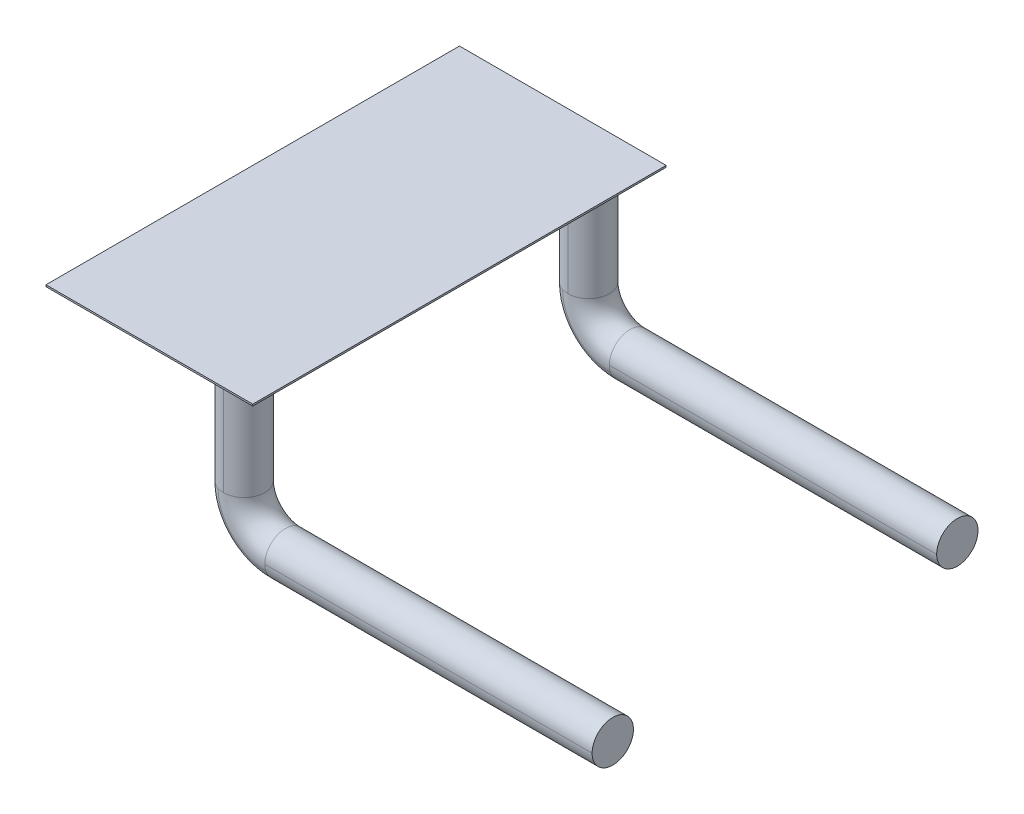
ISO-10303-21;
HEADER;
FILE_DESCRIPTION(('STEP AP214'),'2;1');
FILE_NAME('part.step','',(''),(''),'','','');
FILE_SCHEMA(('AUTOMOTIVE_DESIGN { 1 0 10303 214 1 1 1 1 }'));
ENDSEC;
DATA;
#1=APPLICATION_CONTEXT('core data for automotive mechanical design processes');
#2=APPLICATION_PROTOCOL_DEFINITION('international standard','automotive_design',2000,#1);
#3=PRODUCT_CONTEXT('',#1,'mechanical');
#4=PRODUCT('Part','Part','',(#3));
#5=PRODUCT_RELATED_PRODUCT_CATEGORY('part','',(#4));
#6=PRODUCT_DEFINITION_FORMATION('','',#4);
#7=PRODUCT_DEFINITION_CONTEXT('part definition',#1,'design');
#8=PRODUCT_DEFINITION('design','',#6,#7);
#9=PRODUCT_DEFINITION_SHAPE('','',#8);
#10=(LENGTH_UNIT() NAMED_UNIT(*) SI_UNIT(.MILLI.,.METRE.));
#11=(NAMED_UNIT(*) PLANE_ANGLE_UNIT() SI_UNIT($,.RADIAN.));
#12=(NAMED_UNIT(*) SI_UNIT($,.STERADIAN.) SOLID_ANGLE_UNIT());
#13=UNCERTAINTY_MEASURE_WITH_UNIT(LENGTH_MEASURE(1.E-05),#10,'distance_accuracy_value','');
#14=(GEOMETRIC_REPRESENTATION_CONTEXT(3) GLOBAL_UNCERTAINTY_ASSIGNED_CONTEXT((#13)) GLOBAL_UNIT_ASSIGNED_CONTEXT((#10,
#11,#12)) REPRESENTATION_CONTEXT('',''));
#15=CARTESIAN_POINT('',(0.,0.,0.));
#16=DIRECTION('',(0.,0.,1.));
#17=DIRECTION('',(1.,0.,0.));
#18=AXIS2_PLACEMENT_3D('',#15,#16,#17);
#19=CARTESIAN_POINT('',(1.6256,0.0254,-3.048));
#20=DIRECTION('',(0.,0.,1.));
#21=DIRECTION('',(1.,0.,0.));
#22=AXIS2_PLACEMENT_3D('',#19,#20,#21);
#23=PLANE('',#22);
#24=DIRECTION('',(-1.,0.,0.));
#25=VECTOR('',#24,1.);
#26=CARTESIAN_POINT('',(1.6256,0.,-3.048));
#27=LINE('',#26,#25);
#28=CARTESIAN_POINT('',(1.6256,0.,-3.048));
#29=VERTEX_POINT('',#28);
#30=CARTESIAN_POINT('',(-1.4224,0.,-3.048));
#31=VERTEX_POINT('',#30);
#32=EDGE_CURVE('E11',#29,#31,#27,.T.);
#33=ORIENTED_EDGE('',*,*,#32,.T.);
#34=DIRECTION('',(0.,-1.,0.));
#35=VECTOR('',#34,1.);
#36=CARTESIAN_POINT('',(-1.4224,0.0254,-3.048));
#37=LINE('',#36,#35);
#38=CARTESIAN_POINT('',(-1.4224,0.0254,-3.048));
#39=VERTEX_POINT('',#38);
#40=EDGE_CURVE('E25',#39,#31,#37,.T.);
#41=ORIENTED_EDGE('',*,*,#40,.F.);
#42=DIRECTION('',(-1.,0.,0.));
#43=VECTOR('',#42,1.);
#44=CARTESIAN_POINT('',(1.6256,0.0254,-3.048));
#45=LINE('',#44,#43);
#46=CARTESIAN_POINT('',(1.6256,0.0254,-3.048));
#47=VERTEX_POINT('',#46);
#48=EDGE_CURVE('E408',#47,#39,#45,.T.);
#49=ORIENTED_EDGE('',*,*,#48,.F.);
#50=DIRECTION('',(0.,-1.,0.));
#51=VECTOR('',#50,1.);
#52=CARTESIAN_POINT('',(1.6256,0.0254,-3.048));
#53=LINE('',#52,#51);
#54=EDGE_CURVE('E404',#47,#29,#53,.T.);
#55=ORIENTED_EDGE('',*,*,#54,.T.);
#56=EDGE_LOOP('',(#33,#41,#49,#55));
#57=FACE_BOUND('',#56,.T.);
#58=ADVANCED_FACE('F17',(#57),#23,.F.);
#59=CARTESIAN_POINT('',(1.6256,0.0254,3.048));
#60=DIRECTION('',(-1.,0.,0.));
#61=DIRECTION('',(0.,0.,1.));
#62=AXIS2_PLACEMENT_3D('',#59,#60,#61);
#63=PLANE('',#62);
#64=DIRECTION('',(0.,0.,-1.));
#65=VECTOR('',#64,1.);
#66=CARTESIAN_POINT('',(1.6256,0.,3.048));
#67=LINE('',#66,#65);
#68=CARTESIAN_POINT('',(1.6256,0.,3.048));
#69=VERTEX_POINT('',#68);
#70=EDGE_CURVE('E399',#69,#29,#67,.T.);
#71=ORIENTED_EDGE('',*,*,#70,.T.);
#72=ORIENTED_EDGE('',*,*,#54,.F.);
#73=DIRECTION('',(0.,0.,-1.));
#74=VECTOR('',#73,1.);
#75=CARTESIAN_POINT('',(1.6256,0.0254,3.048));
#76=LINE('',#75,#74);
#77=CARTESIAN_POINT('',(1.6256,0.0254,3.048));
#78=VERTEX_POINT('',#77);
#79=EDGE_CURVE('E394',#78,#47,#76,.T.);
#80=ORIENTED_EDGE('',*,*,#79,.F.);
#81=DIRECTION('',(0.,-1.,0.));
#82=VECTOR('',#81,1.);
#83=CARTESIAN_POINT('',(1.6256,0.0254,3.048));
#84=LINE('',#83,#82);
#85=EDGE_CURVE('E390',#78,#69,#84,.T.);
#86=ORIENTED_EDGE('',*,*,#85,.T.);
#87=EDGE_LOOP('',(#71,#72,#80,#86));
#88=FACE_BOUND('',#87,.T.);
#89=ADVANCED_FACE('F426',(#88),#63,.F.);
#90=CARTESIAN_POINT('',(-1.4224,0.0254,3.048));
#91=DIRECTION('',(0.,0.,-1.));
#92=DIRECTION('',(-1.,0.,0.));
#93=AXIS2_PLACEMENT_3D('',#90,#91,#92);
#94=PLANE('',#93);
#95=DIRECTION('',(1.,0.,0.));
#96=VECTOR('',#95,1.);
#97=CARTESIAN_POINT('',(-1.4224,0.,3.048));
#98=LINE('',#97,#96);
#99=CARTESIAN_POINT('',(-1.4224,0.,3.048));
#100=VERTEX_POINT('',#99);
#101=EDGE_CURVE('E385',#100,#69,#98,.T.);
#102=ORIENTED_EDGE('',*,*,#101,.T.);
#103=ORIENTED_EDGE('',*,*,#85,.F.);
#104=DIRECTION('',(1.,0.,0.));
#105=VECTOR('',#104,1.);
#106=CARTESIAN_POINT('',(-1.4224,0.0254,3.048));
#107=LINE('',#106,#105);
#108=CARTESIAN_POINT('',(-1.4224,0.0254,3.048));
#109=VERTEX_POINT('',#108);
#110=EDGE_CURVE('E380',#109,#78,#107,.T.);
#111=ORIENTED_EDGE('',*,*,#110,.F.);
#112=DIRECTION('',(0.,-1.,0.));
#113=VECTOR('',#112,1.);
#114=CARTESIAN_POINT('',(-1.4224,0.0254,3.048));
#115=LINE('',#114,#113);
#116=EDGE_CURVE('E376',#109,#100,#115,.T.);
#117=ORIENTED_EDGE('',*,*,#116,.T.);
#118=EDGE_LOOP('',(#102,#103,#111,#117));
#119=FACE_BOUND('',#118,.T.);
#120=ADVANCED_FACE('F431',(#119),#94,.F.);
#121=CARTESIAN_POINT('',(-1.4224,0.0254,-3.048));
#122=DIRECTION('',(1.,0.,0.));
#123=DIRECTION('',(0.,0.,-1.));
#124=AXIS2_PLACEMENT_3D('',#121,#122,#123);
#125=PLANE('',#124);
#126=DIRECTION('',(0.,0.,1.));
#127=VECTOR('',#126,1.);
#128=CARTESIAN_POINT('',(-1.4224,0.,-3.048));
#129=LINE('',#128,#127);
#130=EDGE_CURVE('E371',#31,#100,#129,.T.);
#131=ORIENTED_EDGE('',*,*,#130,.T.);
#132=ORIENTED_EDGE('',*,*,#116,.F.);
#133=DIRECTION('',(0.,0.,1.));
#134=VECTOR('',#133,1.);
#135=CARTESIAN_POINT('',(-1.4224,0.0254,-3.048));
#136=LINE('',#135,#134);
#137=EDGE_CURVE('E366',#39,#109,#136,.T.);
#138=ORIENTED_EDGE('',*,*,#137,.F.);
#139=ORIENTED_EDGE('',*,*,#40,.T.);
#140=EDGE_LOOP('',(#131,#132,#138,#139));
#141=FACE_BOUND('',#140,.T.);
#142=ADVANCED_FACE('F418',(#141),#125,.F.);
#143=CARTESIAN_POINT('',(0.,0.0254,0.));
#144=DIRECTION('',(0.,1.,0.));
#145=DIRECTION('',(0.,0.,1.));
#146=AXIS2_PLACEMENT_3D('',#143,#144,#145);
#147=PLANE('',#146);
#148=ORIENTED_EDGE('',*,*,#48,.T.);
#149=ORIENTED_EDGE('',*,*,#137,.T.);
#150=ORIENTED_EDGE('',*,*,#110,.T.);
#151=ORIENTED_EDGE('',*,*,#79,.T.);
#152=EDGE_LOOP('',(#148,#149,#150,#151));
#153=FACE_BOUND('',#152,.T.);
#154=ADVANCED_FACE('F422',(#153),#147,.T.);
#155=CARTESIAN_POINT('',(0.,0.,0.));
#156=DIRECTION('',(0.,1.,0.));
#157=DIRECTION('',(0.,0.,1.));
#158=AXIS2_PLACEMENT_3D('',#155,#156,#157);
#159=PLANE('',#158);
#160=CARTESIAN_POINT('',(0.9906,0.,2.54));
#161=DIRECTION('',(0.,1.,0.));
#162=DIRECTION('',(1.,0.,0.));
#163=AXIS2_PLACEMENT_3D('',#160,#161,#162);
#164=CIRCLE('',#163,0.3048);
#165=CARTESIAN_POINT('',(0.9906,0.,2.2352));
#166=VERTEX_POINT('',#165);
#167=CARTESIAN_POINT('',(0.9906,0.,2.8448));
#168=VERTEX_POINT('',#167);
#169=EDGE_CURVE('E362',#166,#168,#164,.T.);
#170=ORIENTED_EDGE('',*,*,#169,.T.);
#171=CARTESIAN_POINT('',(0.9906,0.,2.54));
#172=DIRECTION('',(0.,1.,0.));
#173=DIRECTION('',(0.,0.,1.));
#174=AXIS2_PLACEMENT_3D('',#171,#172,#173);
#175=CIRCLE('',#174,0.3048);
#176=EDGE_CURVE('E358',#168,#166,#175,.T.);
#177=ORIENTED_EDGE('',*,*,#176,.T.);
#178=EDGE_LOOP('',(#170,#177));
#179=FACE_BOUND('',#178,.T.);
#180=CARTESIAN_POINT('',(0.9906,0.,-2.54));
#181=DIRECTION('',(0.,1.,0.));
#182=DIRECTION('',(1.,0.,0.));
#183=AXIS2_PLACEMENT_3D('',#180,#181,#182);
#184=CIRCLE('',#183,0.3048);
#185=CARTESIAN_POINT('',(0.9906,0.,-2.8448));
#186=VERTEX_POINT('',#185);
#187=CARTESIAN_POINT('',(0.9906,0.,-2.2352));
#188=VERTEX_POINT('',#187);
#189=EDGE_CURVE('E354',#186,#188,#184,.T.);
#190=ORIENTED_EDGE('',*,*,#189,.T.);
#191=CARTESIAN_POINT('',(0.9906,0.,-2.54));
#192=DIRECTION('',(0.,1.,0.));
#193=DIRECTION('',(0.,0.,1.));
#194=AXIS2_PLACEMENT_3D('',#191,#192,#193);
#195=CIRCLE('',#194,0.3048);
#196=EDGE_CURVE('E350',#188,#186,#195,.T.);
#197=ORIENTED_EDGE('',*,*,#196,.T.);
#198=EDGE_LOOP('',(#190,#197));
#199=FACE_BOUND('',#198,.T.);
#200=ORIENTED_EDGE('',*,*,#32,.F.);
#201=ORIENTED_EDGE('',*,*,#70,.F.);
#202=ORIENTED_EDGE('',*,*,#101,.F.);
#203=ORIENTED_EDGE('',*,*,#130,.F.);
#204=EDGE_LOOP('',(#200,#201,#202,#203));
#205=FACE_BOUND('',#204,.T.);
#206=ADVANCED_FACE('F429',(#179,#199,#205),#159,.F.);
#207=CARTESIAN_POINT('',(0.9906,-1.524,-2.54));
#208=DIRECTION('',(0.,1.,0.));
#209=DIRECTION('',(-1.,0.,0.));
#210=AXIS2_PLACEMENT_3D('',#207,#208,#209);
#211=CYLINDRICAL_SURFACE('',#210,0.3048);
#212=DIRECTION('',(0.,1.,0.));
#213=VECTOR('',#212,1.);
#214=CARTESIAN_POINT('',(0.9906,-1.524,-2.8448));
#215=LINE('',#214,#213);
#216=CARTESIAN_POINT('',(0.9906,-1.524,-2.8448));
#217=VERTEX_POINT('',#216);
#218=EDGE_CURVE('E345',#217,#186,#215,.T.);
#219=ORIENTED_EDGE('',*,*,#218,.T.);
#220=ORIENTED_EDGE('',*,*,#196,.F.);
#221=DIRECTION('',(0.,1.,0.));
#222=VECTOR('',#221,1.);
#223=CARTESIAN_POINT('',(0.9906,-1.524,-2.2352));
#224=LINE('',#223,#222);
#225=CARTESIAN_POINT('',(0.9906,-1.524,-2.2352));
#226=VERTEX_POINT('',#225);
#227=EDGE_CURVE('E340',#226,#188,#224,.T.);
#228=ORIENTED_EDGE('',*,*,#227,.F.);
#229=CARTESIAN_POINT('',(0.9906,-1.524,-2.54));
#230=DIRECTION('',(0.,-1.,0.));
#231=DIRECTION('',(0.,0.,-1.));
#232=AXIS2_PLACEMENT_3D('',#229,#230,#231);
#233=CIRCLE('',#232,0.3048);
#234=CARTESIAN_POINT('',(1.08478837988548,-1.524,-2.82988202616676));
#235=VERTEX_POINT('',#234);
#236=EDGE_CURVE('E335',#235,#226,#233,.T.);
#237=ORIENTED_EDGE('',*,*,#236,.F.);
#238=CARTESIAN_POINT('',(0.9906,-1.524,-2.54));
#239=DIRECTION('',(0.,-1.,0.));
#240=DIRECTION('',(0.,0.,-1.));
#241=AXIS2_PLACEMENT_3D('',#238,#239,#240);
#242=CIRCLE('',#241,0.3048);
#243=EDGE_CURVE('E330',#217,#235,#242,.T.);
#244=ORIENTED_EDGE('',*,*,#243,.F.);
#245=EDGE_LOOP('',(#219,#220,#228,#237,#244));
#246=FACE_BOUND('',#245,.T.);
#247=ADVANCED_FACE('F299',(#246),#211,.T.);
#248=CARTESIAN_POINT('',(1.6002,-1.524,-2.54));
#249=DIRECTION('',(0.,0.,1.));
#250=DIRECTION('',(0.707106781186548,0.707106781186547,0.));
#251=AXIS2_PLACEMENT_3D('',#248,#249,#250);
#252=TOROIDAL_SURFACE('',#251,0.6096,0.3048);
#253=CARTESIAN_POINT('',(1.6002,-1.524,-2.82988202616676));
#254=DIRECTION('',(0.,0.,1.));
#255=DIRECTION('',(-1.,0.,0.));
#256=AXIS2_PLACEMENT_3D('',#253,#254,#255);
#257=CIRCLE('',#256,0.515411620114516);
#258=CARTESIAN_POINT('',(1.6002,-2.03941162011452,-2.82988202616676));
#259=VERTEX_POINT('',#258);
#260=EDGE_CURVE('E326',#235,#259,#257,.T.);
#261=ORIENTED_EDGE('',*,*,#260,.T.);
#262=CARTESIAN_POINT('',(1.6002,-2.1336,-2.54));
#263=DIRECTION('',(1.,0.,0.));
#264=DIRECTION('',(0.,0.,-1.));
#265=AXIS2_PLACEMENT_3D('',#262,#263,#264);
#266=CIRCLE('',#265,0.3048);
#267=CARTESIAN_POINT('',(1.6002,-2.1336,-2.8448));
#268=VERTEX_POINT('',#267);
#269=EDGE_CURVE('E321',#268,#259,#266,.T.);
#270=ORIENTED_EDGE('',*,*,#269,.F.);
#271=CARTESIAN_POINT('',(1.6002,-2.1336,-2.54));
#272=DIRECTION('',(1.,0.,0.));
#273=DIRECTION('',(0.,0.,-1.));
#274=AXIS2_PLACEMENT_3D('',#271,#272,#273);
#275=CIRCLE('',#274,0.3048);
#276=CARTESIAN_POINT('',(1.6002,-2.22778837988548,-2.25011797383324));
#277=VERTEX_POINT('',#276);
#278=EDGE_CURVE('E318',#277,#268,#275,.T.);
#279=ORIENTED_EDGE('',*,*,#278,.F.);
#280=CARTESIAN_POINT('',(0.896411620114516,-1.524,-2.25011797383324));
#281=CARTESIAN_POINT('',(0.896411375837469,-1.53551572206614,-2.25011797383324));
#282=CARTESIAN_POINT('',(0.896694249475395,-1.5470314233467,-2.25011797383324));
#283=CARTESIAN_POINT('',(0.897824478605363,-1.57003509469258,-2.25011797383324));
#284=CARTESIAN_POINT('',(0.898671834097407,-1.5815230647579,-2.25011797383324));
#285=CARTESIAN_POINT('',(0.900929272959786,-1.6044435840292,-2.25011797383324));
#286=CARTESIAN_POINT('',(0.902339356330123,-1.6158761332352,-2.25011797383324));
#287=CARTESIAN_POINT('',(0.905718776932097,-1.63865827255834,-2.25011797383324));
#288=CARTESIAN_POINT('',(0.907688114163735,-1.6500078626755,-2.25011797383324));
#289=CARTESIAN_POINT('',(0.912181318815226,-1.67259674065064,-2.25011797383324));
#290=CARTESIAN_POINT('',(0.914705186235078,-1.68383602850864,-2.25011797383324));
#291=CARTESIAN_POINT('',(0.920301365516775,-1.70617722580817,-2.25011797383324));
#292=CARTESIAN_POINT('',(0.923373677378621,-1.71727913524971,-2.25011797383324));
#293=CARTESIAN_POINT('',(0.930059345557295,-1.73931883017129,-2.25011797383324));
#294=CARTESIAN_POINT('',(0.933672701874124,-1.75025661565134,-2.25011797383324));
#295=CARTESIAN_POINT('',(0.941431753673975,-1.7719417125862,-2.25011797383324));
#296=CARTESIAN_POINT('',(0.945577449156996,-1.782689024041,-2.25011797383324));
#297=CARTESIAN_POINT('',(0.954391192052051,-1.80396728170549,-2.25011797383324));
#298=CARTESIAN_POINT('',(0.959059239464083,-1.81449822791517,-2.25011797383324));
#299=CARTESIAN_POINT('',(0.968906440453573,-1.835318385119,-2.25011797383324));
#300=CARTESIAN_POINT('',(0.974085594031031,-1.84560759611314,-2.25011797383324));
#301=CARTESIAN_POINT('',(0.984942530324397,-1.865919495275,-2.25011797383324));
#302=CARTESIAN_POINT('',(0.990620313040307,-1.87594218344272,-2.25011797383324));
#303=CARTESIAN_POINT('',(1.00246082933265,-1.89569689141814,-2.25011797383324));
#304=CARTESIAN_POINT('',(1.00862356290909,-1.90542891122585,-2.25011797383324));
#305=CARTESIAN_POINT('',(1.02141913435807,-1.92457883719309,-2.25011797383324));
#306=CARTESIAN_POINT('',(1.02805197223061,-1.93399674335262,-2.25011797383324));
#307=CARTESIAN_POINT('',(1.04177177318423,-1.95249575346266,-2.25011797383324));
#308=CARTESIAN_POINT('',(1.04885873626532,-1.96157685741317,-2.25011797383324));
#309=CARTESIAN_POINT('',(1.06346971452127,-1.97938038593035,-2.25011797383324));
#310=CARTESIAN_POINT('',(1.07099372969614,-1.98810281049702,-2.25011797383324));
#311=CARTESIAN_POINT('',(1.08646068612807,-2.00516796716173,-2.25011797383324));
#312=CARTESIAN_POINT('',(1.09440362738513,-2.01351069925977,-2.25011797383324));
#313=CARTESIAN_POINT('',(1.11068930074023,-2.02979637261487,-2.25011797383324));
#314=CARTESIAN_POINT('',(1.11903203283827,-2.03773931387193,-2.25011797383324));
#315=CARTESIAN_POINT('',(1.13609718950298,-2.05320627030386,-2.25011797383324));
#316=CARTESIAN_POINT('',(1.14481961406965,-2.06073028547873,-2.25011797383324));
#317=CARTESIAN_POINT('',(1.16262314258683,-2.07534126373468,-2.25011797383324));
#318=CARTESIAN_POINT('',(1.17170424653734,-2.08242822681577,-2.25011797383324));
#319=CARTESIAN_POINT('',(1.19020325664738,-2.09614802776939,-2.25011797383324));
#320=CARTESIAN_POINT('',(1.19962116280691,-2.10278086564193,-2.25011797383324));
#321=CARTESIAN_POINT('',(1.21877108877415,-2.11557643709091,-2.25011797383324));
#322=CARTESIAN_POINT('',(1.22850310858186,-2.12173917066735,-2.25011797383324));
#323=CARTESIAN_POINT('',(1.24825781655728,-2.13357968695969,-2.25011797383324));
#324=CARTESIAN_POINT('',(1.258280504725,-2.1392574696756,-2.25011797383324));
#325=CARTESIAN_POINT('',(1.27859240388686,-2.15011440596897,-2.25011797383324));
#326=CARTESIAN_POINT('',(1.288881614881,-2.15529355954643,-2.25011797383324));
#327=CARTESIAN_POINT('',(1.30970177208483,-2.16514076053592,-2.25011797383324));
#328=CARTESIAN_POINT('',(1.32023271829451,-2.16980880794795,-2.25011797383324));
#329=CARTESIAN_POINT('',(1.341510975959,-2.178622550843,-2.25011797383324));
#330=CARTESIAN_POINT('',(1.35225828741381,-2.18276824632603,-2.25011797383324));
#331=CARTESIAN_POINT('',(1.37394338434866,-2.19052729812588,-2.25011797383324));
#332=CARTESIAN_POINT('',(1.38488116982871,-2.19414065444271,-2.25011797383324));
#333=CARTESIAN_POINT('',(1.4069208647503,-2.20082632262138,-2.25011797383324));
#334=CARTESIAN_POINT('',(1.41802277419183,-2.20389863448323,-2.25011797383324));
#335=CARTESIAN_POINT('',(1.44036397149136,-2.20949481376492,-2.25011797383324));
#336=CARTESIAN_POINT('',(1.45160325934936,-2.21201868118477,-2.25011797383324));
#337=CARTESIAN_POINT('',(1.47419213732451,-2.21651188583626,-2.25011797383324));
#338=CARTESIAN_POINT('',(1.48554172744166,-2.2184812230679,-2.25011797383324));
#339=CARTESIAN_POINT('',(1.50832386676481,-2.22186064366988,-2.25011797383324));
#340=CARTESIAN_POINT('',(1.5197564159708,-2.22327072704021,-2.25011797383324));
#341=CARTESIAN_POINT('',(1.5426769352421,-2.22552816590259,-2.25011797383324));
#342=CARTESIAN_POINT('',(1.55416490530742,-2.22637552139464,-2.25011797383324));
#343=CARTESIAN_POINT('',(1.5771685766533,-2.22750575052461,-2.25011797383324));
#344=CARTESIAN_POINT('',(1.58868427793386,-2.22778862416253,-2.25011797383324));
#345=CARTESIAN_POINT('',(1.6002,-2.22778837988548,-2.25011797383324));
#346=B_SPLINE_CURVE_WITH_KNOTS('',3,(#280,#281,#282,#283,#284,#285,#286,#287,#288,#289,#290,
#291,#292,#293,#294,#295,#296,#297,#298,#299,#300,#301,#302,#303,#304,#305,#306,#307,#308,#309,
#310,#311,#312,#313,#314,#315,#316,#317,#318,#319,#320,#321,#322,#323,#324,#325,#326,#327,#328,
#329,#330,#331,#332,#333,#334,#335,#336,#337,#338,#339,#340,#341,#342,#343,#344,#345),
.UNSPECIFIED.,.F.,.F.,(4,2,2,2,2,2,2,2,2,2,2,2,2,2,2,2,2,2,2,2,2,2,2,2,2,2,2,2,2,2,2,2,4),(0.,
0.0345436629250793,0.0690873258501591,0.103630988775239,0.138174651700319,0.172718314625398,
0.207261977550478,0.241805640475558,0.276349303400638,0.310892966325717,0.345436629250797,
0.379980292175877,0.414523955100956,0.449067618026036,0.483611280951116,0.518154943876196,
0.552698606801275,0.587242269726355,0.621785932651434,0.656329595576514,0.690873258501594,
0.725416921426673,0.759960584351753,0.794504247276833,0.829047910201912,0.863591573126992,
0.898135236052072,0.932678898977152,0.967222561902231,1.00176622482731,1.03630988775239,
1.07085355067747,1.10539721360255),.UNSPECIFIED.);
#347=CARTESIAN_POINT('',(0.896411620114516,-1.524,-2.25011797383324));
#348=VERTEX_POINT('',#347);
#349=EDGE_CURVE('E316',#348,#277,#346,.T.);
#350=ORIENTED_EDGE('',*,*,#349,.F.);
#351=CARTESIAN_POINT('',(0.9906,-1.524,-2.54));
#352=DIRECTION('',(0.,-1.,0.));
#353=DIRECTION('',(0.,0.,-1.));
#354=AXIS2_PLACEMENT_3D('',#351,#352,#353);
#355=CIRCLE('',#354,0.3048);
#356=EDGE_CURVE('E640',#348,#217,#355,.T.);
#357=ORIENTED_EDGE('',*,*,#356,.T.);
#358=ORIENTED_EDGE('',*,*,#243,.T.);
#359=EDGE_LOOP('',(#261,#270,#279,#350,#357,#358));
#360=FACE_BOUND('',#359,.T.);
#361=ADVANCED_FACE('F294',(#360),#252,.T.);
#362=CARTESIAN_POINT('',(0.9906,-1.524,-2.54));
#363=DIRECTION('',(0.,1.,0.));
#364=DIRECTION('',(1.,0.,0.));
#365=AXIS2_PLACEMENT_3D('',#362,#363,#364);
#366=CYLINDRICAL_SURFACE('',#365,0.3048);
#367=ORIENTED_EDGE('',*,*,#218,.F.);
#368=ORIENTED_EDGE('',*,*,#356,.F.);
#369=CARTESIAN_POINT('',(0.9906,-1.524,-2.54));
#370=DIRECTION('',(0.,-1.,0.));
#371=DIRECTION('',(0.,0.,-1.));
#372=AXIS2_PLACEMENT_3D('',#369,#370,#371);
#373=CIRCLE('',#372,0.3048);
#374=EDGE_CURVE('E269',#226,#348,#373,.T.);
#375=ORIENTED_EDGE('',*,*,#374,.F.);
#376=ORIENTED_EDGE('',*,*,#227,.T.);
#377=ORIENTED_EDGE('',*,*,#189,.F.);
#378=EDGE_LOOP('',(#367,#368,#375,#376,#377));
#379=FACE_BOUND('',#378,.T.);
#380=ADVANCED_FACE('F289',(#379),#366,.T.);
#381=CARTESIAN_POINT('',(1.6002,-1.524,-2.54));
#382=DIRECTION('',(0.,0.,1.));
#383=DIRECTION('',(0.707106781186548,0.707106781186547,0.));
#384=AXIS2_PLACEMENT_3D('',#381,#382,#383);
#385=TOROIDAL_SURFACE('',#384,0.6096,0.3048);
#386=ORIENTED_EDGE('',*,*,#260,.F.);
#387=ORIENTED_EDGE('',*,*,#236,.T.);
#388=ORIENTED_EDGE('',*,*,#374,.T.);
#389=ORIENTED_EDGE('',*,*,#349,.T.);
#390=CARTESIAN_POINT('',(1.6002,-2.1336,-2.54));
#391=DIRECTION('',(1.,0.,0.));
#392=DIRECTION('',(0.,0.,-1.));
#393=AXIS2_PLACEMENT_3D('',#390,#391,#392);
#394=CIRCLE('',#393,0.3048);
#395=CARTESIAN_POINT('',(1.6002,-2.1336,-2.2352));
#396=VERTEX_POINT('',#395);
#397=EDGE_CURVE('E264',#396,#277,#394,.T.);
#398=ORIENTED_EDGE('',*,*,#397,.F.);
#399=CARTESIAN_POINT('',(1.6002,-2.1336,-2.54));
#400=DIRECTION('',(1.,0.,0.));
#401=DIRECTION('',(0.,0.,-1.));
#402=AXIS2_PLACEMENT_3D('',#399,#400,#401);
#403=CIRCLE('',#402,0.3048);
#404=EDGE_CURVE('E259',#259,#396,#403,.T.);
#405=ORIENTED_EDGE('',*,*,#404,.F.);
#406=EDGE_LOOP('',(#386,#387,#388,#389,#398,#405));
#407=FACE_BOUND('',#406,.T.);
#408=ADVANCED_FACE('F278',(#407),#385,.T.);
#409=CARTESIAN_POINT('',(1.6002,-2.1336,-2.54));
#410=DIRECTION('',(1.,0.,0.));
#411=DIRECTION('',(0.,-1.,0.));
#412=AXIS2_PLACEMENT_3D('',#409,#410,#411);
#413=CYLINDRICAL_SURFACE('',#412,0.3048);
#414=DIRECTION('',(1.,0.,0.));
#415=VECTOR('',#414,1.);
#416=CARTESIAN_POINT('',(1.6002,-2.1336,-2.2352));
#417=LINE('',#416,#415);
#418=CARTESIAN_POINT('',(6.4262,-2.1336,-2.2352));
#419=VERTEX_POINT('',#418);
#420=EDGE_CURVE('E255',#396,#419,#417,.T.);
#421=ORIENTED_EDGE('',*,*,#420,.T.);
#422=CARTESIAN_POINT('',(6.4262,-2.1336,-2.54));
#423=DIRECTION('',(1.,0.,0.));
#424=DIRECTION('',(0.,0.,-1.));
#425=AXIS2_PLACEMENT_3D('',#422,#423,#424);
#426=CIRCLE('',#425,0.3048);
#427=CARTESIAN_POINT('',(6.4262,-2.1336,-2.8448));
#428=VERTEX_POINT('',#427);
#429=EDGE_CURVE('E250',#428,#419,#426,.T.);
#430=ORIENTED_EDGE('',*,*,#429,.F.);
#431=DIRECTION('',(1.,0.,0.));
#432=VECTOR('',#431,1.);
#433=CARTESIAN_POINT('',(1.6002,-2.1336,-2.8448));
#434=LINE('',#433,#432);
#435=EDGE_CURVE('E245',#268,#428,#434,.T.);
#436=ORIENTED_EDGE('',*,*,#435,.F.);
#437=ORIENTED_EDGE('',*,*,#269,.T.);
#438=ORIENTED_EDGE('',*,*,#404,.T.);
#439=EDGE_LOOP('',(#421,#430,#436,#437,#438));
#440=FACE_BOUND('',#439,.T.);
#441=ADVANCED_FACE('F288',(#440),#413,.T.);
#442=CARTESIAN_POINT('',(1.6002,-2.1336,-2.54));
#443=DIRECTION('',(1.,0.,0.));
#444=DIRECTION('',(0.,1.,0.));
#445=AXIS2_PLACEMENT_3D('',#442,#443,#444);
#446=CYLINDRICAL_SURFACE('',#445,0.3048);
#447=ORIENTED_EDGE('',*,*,#420,.F.);
#448=ORIENTED_EDGE('',*,*,#397,.T.);
#449=ORIENTED_EDGE('',*,*,#278,.T.);
#450=ORIENTED_EDGE('',*,*,#435,.T.);
#451=CARTESIAN_POINT('',(6.4262,-2.1336,-2.54));
#452=DIRECTION('',(1.,0.,0.));
#453=DIRECTION('',(0.,0.,-1.));
#454=AXIS2_PLACEMENT_3D('',#451,#452,#453);
#455=CIRCLE('',#454,0.3048);
#456=EDGE_CURVE('E240',#419,#428,#455,.T.);
#457=ORIENTED_EDGE('',*,*,#456,.F.);
#458=EDGE_LOOP('',(#447,#448,#449,#450,#457));
#459=FACE_BOUND('',#458,.T.);
#460=ADVANCED_FACE('F522',(#459),#446,.T.);
#461=CARTESIAN_POINT('',(6.4262,-2.1336,-2.54));
#462=DIRECTION('',(1.,0.,0.));
#463=DIRECTION('',(0.,0.,-1.));
#464=AXIS2_PLACEMENT_3D('',#461,#462,#463);
#465=PLANE('',#464);
#466=ORIENTED_EDGE('',*,*,#429,.T.);
#467=ORIENTED_EDGE('',*,*,#456,.T.);
#468=EDGE_LOOP('',(#466,#467));
#469=FACE_BOUND('',#468,.T.);
#470=ADVANCED_FACE('F532',(#469),#465,.T.);
#471=CARTESIAN_POINT('',(0.9906,-1.524,2.54));
#472=DIRECTION('',(0.,1.,0.));
#473=DIRECTION('',(-1.,0.,0.));
#474=AXIS2_PLACEMENT_3D('',#471,#472,#473);
#475=CYLINDRICAL_SURFACE('',#474,0.3048);
#476=DIRECTION('',(0.,1.,0.));
#477=VECTOR('',#476,1.);
#478=CARTESIAN_POINT('',(0.9906,-1.524,2.2352));
#479=LINE('',#478,#477);
#480=CARTESIAN_POINT('',(0.9906,-1.524,2.2352));
#481=VERTEX_POINT('',#480);
#482=EDGE_CURVE('E235',#481,#166,#479,.T.);
#483=ORIENTED_EDGE('',*,*,#482,.T.);
#484=ORIENTED_EDGE('',*,*,#176,.F.);
#485=DIRECTION('',(0.,1.,0.));
#486=VECTOR('',#485,1.);
#487=CARTESIAN_POINT('',(0.9906,-1.524,2.8448));
#488=LINE('',#487,#486);
#489=CARTESIAN_POINT('',(0.9906,-1.524,2.8448));
#490=VERTEX_POINT('',#489);
#491=EDGE_CURVE('E230',#490,#168,#488,.T.);
#492=ORIENTED_EDGE('',*,*,#491,.F.);
#493=CARTESIAN_POINT('',(0.9906,-1.524,2.54));
#494=DIRECTION('',(0.,-1.,0.));
#495=DIRECTION('',(0.,0.,-1.));
#496=AXIS2_PLACEMENT_3D('',#493,#494,#495);
#497=CIRCLE('',#496,0.3048);
#498=CARTESIAN_POINT('',(1.08478837988548,-1.524,2.25011797383324));
#499=VERTEX_POINT('',#498);
#500=EDGE_CURVE('E225',#499,#490,#497,.T.);
#501=ORIENTED_EDGE('',*,*,#500,.F.);
#502=CARTESIAN_POINT('',(0.9906,-1.524,2.54));
#503=DIRECTION('',(0.,-1.,0.));
#504=DIRECTION('',(0.,0.,-1.));
#505=AXIS2_PLACEMENT_3D('',#502,#503,#504);
#506=CIRCLE('',#505,0.3048);
#507=EDGE_CURVE('E220',#481,#499,#506,.T.);
#508=ORIENTED_EDGE('',*,*,#507,.F.);
#509=EDGE_LOOP('',(#483,#484,#492,#501,#508));
#510=FACE_BOUND('',#509,.T.);
#511=ADVANCED_FACE('F192',(#510),#475,.T.);
#512=CARTESIAN_POINT('',(1.6002,-1.524,2.54));
#513=DIRECTION('',(0.,0.,1.));
#514=DIRECTION('',(0.707106781186548,0.707106781186547,0.));
#515=AXIS2_PLACEMENT_3D('',#512,#513,#514);
#516=TOROIDAL_SURFACE('',#515,0.6096,0.3048);
#517=CARTESIAN_POINT('',(1.6002,-1.524,2.25011797383324));
#518=DIRECTION('',(0.,0.,1.));
#519=DIRECTION('',(-1.,0.,0.));
#520=AXIS2_PLACEMENT_3D('',#517,#518,#519);
#521=CIRCLE('',#520,0.515411620114516);
#522=CARTESIAN_POINT('',(1.6002,-2.03941162011452,2.25011797383324));
#523=VERTEX_POINT('',#522);
#524=EDGE_CURVE('E216',#499,#523,#521,.T.);
#525=ORIENTED_EDGE('',*,*,#524,.T.);
#526=CARTESIAN_POINT('',(1.6002,-2.1336,2.54));
#527=DIRECTION('',(1.,0.,0.));
#528=DIRECTION('',(0.,0.,-1.));
#529=AXIS2_PLACEMENT_3D('',#526,#527,#528);
#530=CIRCLE('',#529,0.3048);
#531=CARTESIAN_POINT('',(1.6002,-2.1336,2.2352));
#532=VERTEX_POINT('',#531);
#533=EDGE_CURVE('E212',#532,#523,#530,.T.);
#534=ORIENTED_EDGE('',*,*,#533,.F.);
#535=CARTESIAN_POINT('',(1.6002,-2.1336,2.54));
#536=DIRECTION('',(1.,0.,0.));
#537=DIRECTION('',(0.,0.,-1.));
#538=AXIS2_PLACEMENT_3D('',#535,#536,#537);
#539=CIRCLE('',#538,0.3048);
#540=CARTESIAN_POINT('',(1.6002,-2.22778837988548,2.82988202616676));
#541=VERTEX_POINT('',#540);
#542=EDGE_CURVE('E143',#541,#532,#539,.T.);
#543=ORIENTED_EDGE('',*,*,#542,.F.);
#544=CARTESIAN_POINT('',(0.896411620114516,-1.524,2.82988202616676));
#545=CARTESIAN_POINT('',(0.896411375837469,-1.53551572206614,2.82988202616676));
#546=CARTESIAN_POINT('',(0.896694249475395,-1.5470314233467,2.82988202616676));
#547=CARTESIAN_POINT('',(0.897824478605363,-1.57003509469258,2.82988202616676));
#548=CARTESIAN_POINT('',(0.898671834097407,-1.5815230647579,2.82988202616676));
#549=CARTESIAN_POINT('',(0.900929272959786,-1.6044435840292,2.82988202616676));
#550=CARTESIAN_POINT('',(0.902339356330123,-1.6158761332352,2.82988202616676));
#551=CARTESIAN_POINT('',(0.905718776932097,-1.63865827255834,2.82988202616676));
#552=CARTESIAN_POINT('',(0.907688114163735,-1.6500078626755,2.82988202616676));
#553=CARTESIAN_POINT('',(0.912181318815226,-1.67259674065064,2.82988202616676));
#554=CARTESIAN_POINT('',(0.914705186235078,-1.68383602850864,2.82988202616676));
#555=CARTESIAN_POINT('',(0.920301365516775,-1.70617722580817,2.82988202616676));
#556=CARTESIAN_POINT('',(0.923373677378621,-1.71727913524971,2.82988202616676));
#557=CARTESIAN_POINT('',(0.930059345557295,-1.73931883017129,2.82988202616676));
#558=CARTESIAN_POINT('',(0.933672701874124,-1.75025661565134,2.82988202616676));
#559=CARTESIAN_POINT('',(0.941431753673975,-1.7719417125862,2.82988202616676));
#560=CARTESIAN_POINT('',(0.945577449156996,-1.782689024041,2.82988202616676));
#561=CARTESIAN_POINT('',(0.954391192052051,-1.80396728170549,2.82988202616676));
#562=CARTESIAN_POINT('',(0.959059239464083,-1.81449822791517,2.82988202616676));
#563=CARTESIAN_POINT('',(0.968906440453573,-1.835318385119,2.82988202616676));
#564=CARTESIAN_POINT('',(0.974085594031031,-1.84560759611314,2.82988202616676));
#565=CARTESIAN_POINT('',(0.984942530324397,-1.865919495275,2.82988202616676));
#566=CARTESIAN_POINT('',(0.990620313040307,-1.87594218344272,2.82988202616676));
#567=CARTESIAN_POINT('',(1.00246082933265,-1.89569689141814,2.82988202616676));
#568=CARTESIAN_POINT('',(1.00862356290909,-1.90542891122585,2.82988202616676));
#569=CARTESIAN_POINT('',(1.02141913435807,-1.92457883719309,2.82988202616676));
#570=CARTESIAN_POINT('',(1.02805197223061,-1.93399674335262,2.82988202616676));
#571=CARTESIAN_POINT('',(1.04177177318423,-1.95249575346266,2.82988202616676));
#572=CARTESIAN_POINT('',(1.04885873626532,-1.96157685741317,2.82988202616676));
#573=CARTESIAN_POINT('',(1.06346971452127,-1.97938038593035,2.82988202616676));
#574=CARTESIAN_POINT('',(1.07099372969614,-1.98810281049702,2.82988202616676));
#575=CARTESIAN_POINT('',(1.08646068612807,-2.00516796716173,2.82988202616676));
#576=CARTESIAN_POINT('',(1.09440362738513,-2.01351069925977,2.82988202616676));
#577=CARTESIAN_POINT('',(1.11068930074023,-2.02979637261487,2.82988202616676));
#578=CARTESIAN_POINT('',(1.11903203283827,-2.03773931387193,2.82988202616676));
#579=CARTESIAN_POINT('',(1.13609718950298,-2.05320627030386,2.82988202616676));
#580=CARTESIAN_POINT('',(1.14481961406965,-2.06073028547873,2.82988202616676));
#581=CARTESIAN_POINT('',(1.16262314258683,-2.07534126373468,2.82988202616676));
#582=CARTESIAN_POINT('',(1.17170424653734,-2.08242822681577,2.82988202616676));
#583=CARTESIAN_POINT('',(1.19020325664738,-2.09614802776939,2.82988202616676));
#584=CARTESIAN_POINT('',(1.19962116280691,-2.10278086564193,2.82988202616676));
#585=CARTESIAN_POINT('',(1.21877108877415,-2.11557643709091,2.82988202616676));
#586=CARTESIAN_POINT('',(1.22850310858186,-2.12173917066735,2.82988202616676));
#587=CARTESIAN_POINT('',(1.24825781655728,-2.13357968695969,2.82988202616676));
#588=CARTESIAN_POINT('',(1.258280504725,-2.1392574696756,2.82988202616676));
#589=CARTESIAN_POINT('',(1.27859240388686,-2.15011440596897,2.82988202616676));
#590=CARTESIAN_POINT('',(1.288881614881,-2.15529355954643,2.82988202616676));
#591=CARTESIAN_POINT('',(1.30970177208483,-2.16514076053592,2.82988202616676));
#592=CARTESIAN_POINT('',(1.32023271829451,-2.16980880794795,2.82988202616676));
#593=CARTESIAN_POINT('',(1.341510975959,-2.178622550843,2.82988202616676));
#594=CARTESIAN_POINT('',(1.35225828741381,-2.18276824632603,2.82988202616676));
#595=CARTESIAN_POINT('',(1.37394338434866,-2.19052729812588,2.82988202616676));
#596=CARTESIAN_POINT('',(1.38488116982871,-2.19414065444271,2.82988202616676));
#597=CARTESIAN_POINT('',(1.4069208647503,-2.20082632262138,2.82988202616676));
#598=CARTESIAN_POINT('',(1.41802277419183,-2.20389863448323,2.82988202616676));
#599=CARTESIAN_POINT('',(1.44036397149136,-2.20949481376492,2.82988202616676));
#600=CARTESIAN_POINT('',(1.45160325934936,-2.21201868118477,2.82988202616676));
#601=CARTESIAN_POINT('',(1.47419213732451,-2.21651188583626,2.82988202616676));
#602=CARTESIAN_POINT('',(1.48554172744166,-2.2184812230679,2.82988202616676));
#603=CARTESIAN_POINT('',(1.50832386676481,-2.22186064366988,2.82988202616676));
#604=CARTESIAN_POINT('',(1.5197564159708,-2.22327072704021,2.82988202616676));
#605=CARTESIAN_POINT('',(1.5426769352421,-2.22552816590259,2.82988202616676));
#606=CARTESIAN_POINT('',(1.55416490530742,-2.22637552139464,2.82988202616676));
#607=CARTESIAN_POINT('',(1.5771685766533,-2.22750575052461,2.82988202616676));
#608=CARTESIAN_POINT('',(1.58868427793386,-2.22778862416253,2.82988202616676));
#609=CARTESIAN_POINT('',(1.6002,-2.22778837988548,2.82988202616676));
#610=B_SPLINE_CURVE_WITH_KNOTS('',3,(#544,#545,#546,#547,#548,#549,#550,#551,#552,#553,#554,
#555,#556,#557,#558,#559,#560,#561,#562,#563,#564,#565,#566,#567,#568,#569,#570,#571,#572,#573,
#574,#575,#576,#577,#578,#579,#580,#581,#582,#583,#584,#585,#586,#587,#588,#589,#590,#591,#592,
#593,#594,#595,#596,#597,#598,#599,#600,#601,#602,#603,#604,#605,#606,#607,#608,#609),
.UNSPECIFIED.,.F.,.F.,(4,2,2,2,2,2,2,2,2,2,2,2,2,2,2,2,2,2,2,2,2,2,2,2,2,2,2,2,2,2,2,2,4),(0.,
0.0345436629250793,0.0690873258501591,0.103630988775239,0.138174651700319,0.172718314625398,
0.207261977550478,0.241805640475558,0.276349303400638,0.310892966325717,0.345436629250797,
0.379980292175877,0.414523955100956,0.449067618026036,0.483611280951116,0.518154943876196,
0.552698606801275,0.587242269726355,0.621785932651434,0.656329595576514,0.690873258501594,
0.725416921426673,0.759960584351753,0.794504247276833,0.829047910201912,0.863591573126992,
0.898135236052072,0.932678898977152,0.967222561902231,1.00176622482731,1.03630988775239,
1.07085355067747,1.10539721360255),.UNSPECIFIED.);
#611=CARTESIAN_POINT('',(0.896411620114516,-1.524,2.82988202616676));
#612=VERTEX_POINT('',#611);
#613=EDGE_CURVE('E209',#612,#541,#610,.T.);
#614=ORIENTED_EDGE('',*,*,#613,.F.);
#615=CARTESIAN_POINT('',(0.9906,-1.524,2.54));
#616=DIRECTION('',(0.,-1.,0.));
#617=DIRECTION('',(0.,0.,-1.));
#618=AXIS2_PLACEMENT_3D('',#615,#616,#617);
#619=CIRCLE('',#618,0.3048);
#620=EDGE_CURVE('E633',#612,#481,#619,.T.);
#621=ORIENTED_EDGE('',*,*,#620,.T.);
#622=ORIENTED_EDGE('',*,*,#507,.T.);
#623=EDGE_LOOP('',(#525,#534,#543,#614,#621,#622));
#624=FACE_BOUND('',#623,.T.);
#625=ADVANCED_FACE('F187',(#624),#516,.T.);
#626=CARTESIAN_POINT('',(0.9906,-1.524,2.54));
#627=DIRECTION('',(0.,1.,0.));
#628=DIRECTION('',(1.,0.,0.));
#629=AXIS2_PLACEMENT_3D('',#626,#627,#628);
#630=CYLINDRICAL_SURFACE('',#629,0.3048);
#631=ORIENTED_EDGE('',*,*,#482,.F.);
#632=ORIENTED_EDGE('',*,*,#620,.F.);
#633=CARTESIAN_POINT('',(0.9906,-1.524,2.54));
#634=DIRECTION('',(0.,-1.,0.));
#635=DIRECTION('',(0.,0.,-1.));
#636=AXIS2_PLACEMENT_3D('',#633,#634,#635);
#637=CIRCLE('',#636,0.3048);
#638=EDGE_CURVE('E163',#490,#612,#637,.T.);
#639=ORIENTED_EDGE('',*,*,#638,.F.);
#640=ORIENTED_EDGE('',*,*,#491,.T.);
#641=ORIENTED_EDGE('',*,*,#169,.F.);
#642=EDGE_LOOP('',(#631,#632,#639,#640,#641));
#643=FACE_BOUND('',#642,.T.);
#644=ADVANCED_FACE('F182',(#643),#630,.T.);
#645=CARTESIAN_POINT('',(1.6002,-1.524,2.54));
#646=DIRECTION('',(0.,0.,1.));
#647=DIRECTION('',(0.707106781186548,0.707106781186547,0.));
#648=AXIS2_PLACEMENT_3D('',#645,#646,#647);
#649=TOROIDAL_SURFACE('',#648,0.6096,0.3048);
#650=ORIENTED_EDGE('',*,*,#524,.F.);
#651=ORIENTED_EDGE('',*,*,#500,.T.);
#652=ORIENTED_EDGE('',*,*,#638,.T.);
#653=ORIENTED_EDGE('',*,*,#613,.T.);
#654=CARTESIAN_POINT('',(1.6002,-2.1336,2.54));
#655=DIRECTION('',(1.,0.,0.));
#656=DIRECTION('',(0.,0.,-1.));
#657=AXIS2_PLACEMENT_3D('',#654,#655,#656);
#658=CIRCLE('',#657,0.3048);
#659=CARTESIAN_POINT('',(1.6002,-2.1336,2.8448));
#660=VERTEX_POINT('',#659);
#661=EDGE_CURVE('E159',#660,#541,#658,.T.);
#662=ORIENTED_EDGE('',*,*,#661,.F.);
#663=CARTESIAN_POINT('',(1.6002,-2.1336,2.54));
#664=DIRECTION('',(1.,0.,0.));
#665=DIRECTION('',(0.,0.,-1.));
#666=AXIS2_PLACEMENT_3D('',#663,#664,#665);
#667=CIRCLE('',#666,0.3048);
#668=EDGE_CURVE('E155',#523,#660,#667,.T.);
#669=ORIENTED_EDGE('',*,*,#668,.F.);
#670=EDGE_LOOP('',(#650,#651,#652,#653,#662,#669));
#671=FACE_BOUND('',#670,.T.);
#672=ADVANCED_FACE('F172',(#671),#649,.T.);
#673=CARTESIAN_POINT('',(1.6002,-2.1336,2.54));
#674=DIRECTION('',(1.,0.,0.));
#675=DIRECTION('',(0.,-1.,0.));
#676=AXIS2_PLACEMENT_3D('',#673,#674,#675);
#677=CYLINDRICAL_SURFACE('',#676,0.3048);
#678=DIRECTION('',(1.,0.,0.));
#679=VECTOR('',#678,1.);
#680=CARTESIAN_POINT('',(1.6002,-2.1336,2.8448));
#681=LINE('',#680,#679);
#682=CARTESIAN_POINT('',(6.4262,-2.1336,2.8448));
#683=VERTEX_POINT('',#682);
#684=EDGE_CURVE('E134',#660,#683,#681,.T.);
#685=ORIENTED_EDGE('',*,*,#684,.T.);
#686=CARTESIAN_POINT('',(6.4262,-2.1336,2.54));
#687=DIRECTION('',(1.,0.,0.));
#688=DIRECTION('',(0.,0.,-1.));
#689=AXIS2_PLACEMENT_3D('',#686,#687,#688);
#690=CIRCLE('',#689,0.3048);
#691=CARTESIAN_POINT('',(6.4262,-2.1336,2.2352));
#692=VERTEX_POINT('',#691);
#693=EDGE_CURVE('E126',#692,#683,#690,.T.);
#694=ORIENTED_EDGE('',*,*,#693,.F.);
#695=DIRECTION('',(1.,0.,0.));
#696=VECTOR('',#695,1.);
#697=CARTESIAN_POINT('',(1.6002,-2.1336,2.2352));
#698=LINE('',#697,#696);
#699=EDGE_CURVE('E130',#532,#692,#698,.T.);
#700=ORIENTED_EDGE('',*,*,#699,.F.);
#701=ORIENTED_EDGE('',*,*,#533,.T.);
#702=ORIENTED_EDGE('',*,*,#668,.T.);
#703=EDGE_LOOP('',(#685,#694,#700,#701,#702));
#704=FACE_BOUND('',#703,.T.);
#705=ADVANCED_FACE('F128',(#704),#677,.T.);
#706=CARTESIAN_POINT('',(1.6002,-2.1336,2.54));
#707=DIRECTION('',(1.,0.,0.));
#708=DIRECTION('',(0.,1.,0.));
#709=AXIS2_PLACEMENT_3D('',#706,#707,#708);
#710=CYLINDRICAL_SURFACE('',#709,0.3048);
#711=ORIENTED_EDGE('',*,*,#684,.F.);
#712=ORIENTED_EDGE('',*,*,#661,.T.);
#713=ORIENTED_EDGE('',*,*,#542,.T.);
#714=ORIENTED_EDGE('',*,*,#699,.T.);
#715=CARTESIAN_POINT('',(6.4262,-2.1336,2.54));
#716=DIRECTION('',(1.,0.,0.));
#717=DIRECTION('',(0.,0.,-1.));
#718=AXIS2_PLACEMENT_3D('',#715,#716,#717);
#719=CIRCLE('',#718,0.3048);
#720=EDGE_CURVE('E141',#683,#692,#719,.T.);
#721=ORIENTED_EDGE('',*,*,#720,.F.);
#722=EDGE_LOOP('',(#711,#712,#713,#714,#721));
#723=FACE_BOUND('',#722,.T.);
#724=ADVANCED_FACE('F140',(#723),#710,.T.);
#725=CARTESIAN_POINT('',(6.4262,-2.1336,2.54));
#726=DIRECTION('',(1.,0.,0.));
#727=DIRECTION('',(0.,0.,-1.));
#728=AXIS2_PLACEMENT_3D('',#725,#726,#727);
#729=PLANE('',#728);
#730=ORIENTED_EDGE('',*,*,#693,.T.);
#731=ORIENTED_EDGE('',*,*,#720,.T.);
#732=EDGE_LOOP('',(#730,#731));
#733=FACE_BOUND('',#732,.T.);
#734=ADVANCED_FACE('F145',(#733),#729,.T.);
#735=CLOSED_SHELL('',(#58,#89,#120,#142,#154,#206,#247,#361,#380,#408,#441,#460,#470,#511,#625,
#644,#672,#705,#724,#734));
#736=MANIFOLD_SOLID_BREP('B1',#735);
#737=ADVANCED_BREP_SHAPE_REPRESENTATION('',(#18,#736),#14);
#738=SHAPE_DEFINITION_REPRESENTATION(#9,#737);
ENDSEC;
END-ISO-10303-21;
